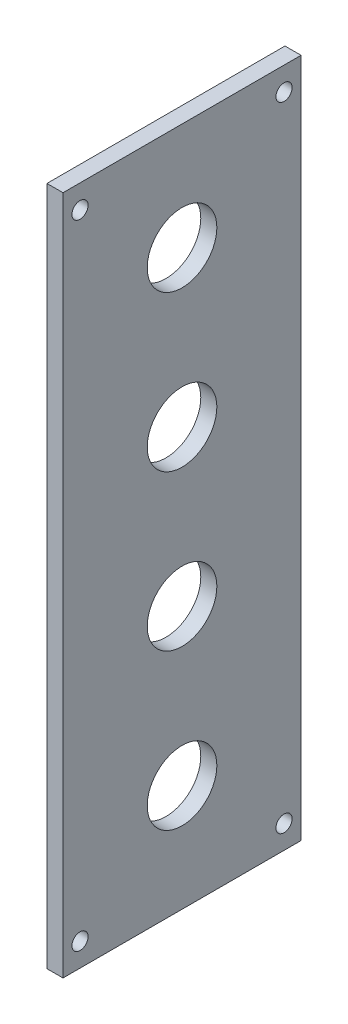
ISO-10303-21;
HEADER;
FILE_DESCRIPTION(('STEP AP214'),'2;1');
FILE_NAME('part.step','',(''),(''),'','','');
FILE_SCHEMA(('AUTOMOTIVE_DESIGN { 1 0 10303 214 1 1 1 1 }'));
ENDSEC;
DATA;
#1=APPLICATION_CONTEXT('core data for automotive mechanical design processes');
#2=APPLICATION_PROTOCOL_DEFINITION('international standard','automotive_design',2000,#1);
#3=PRODUCT_CONTEXT('',#1,'mechanical');
#4=PRODUCT('Part','Part','',(#3));
#5=PRODUCT_RELATED_PRODUCT_CATEGORY('part','',(#4));
#6=PRODUCT_DEFINITION_FORMATION('','',#4);
#7=PRODUCT_DEFINITION_CONTEXT('part definition',#1,'design');
#8=PRODUCT_DEFINITION('design','',#6,#7);
#9=PRODUCT_DEFINITION_SHAPE('','',#8);
#10=(LENGTH_UNIT() NAMED_UNIT(*) SI_UNIT(.MILLI.,.METRE.));
#11=(NAMED_UNIT(*) PLANE_ANGLE_UNIT() SI_UNIT($,.RADIAN.));
#12=(NAMED_UNIT(*) SI_UNIT($,.STERADIAN.) SOLID_ANGLE_UNIT());
#13=UNCERTAINTY_MEASURE_WITH_UNIT(LENGTH_MEASURE(1.E-05),#10,'distance_accuracy_value','');
#14=(GEOMETRIC_REPRESENTATION_CONTEXT(3) GLOBAL_UNCERTAINTY_ASSIGNED_CONTEXT((#13)) GLOBAL_UNIT_ASSIGNED_CONTEXT((#10,
#11,#12)) REPRESENTATION_CONTEXT('',''));
#15=CARTESIAN_POINT('',(0.,0.,0.));
#16=DIRECTION('',(0.,0.,1.));
#17=DIRECTION('',(1.,0.,0.));
#18=AXIS2_PLACEMENT_3D('',#15,#16,#17);
#19=CARTESIAN_POINT('',(-6.,0.,0.));
#20=DIRECTION('',(-1.,0.,0.));
#21=DIRECTION('',(0.,0.,1.));
#22=AXIS2_PLACEMENT_3D('',#19,#20,#21);
#23=PLANE('',#22);
#24=CARTESIAN_POINT('',(-6.,87.0000000000001,6.18172180111288E-13));
#25=DIRECTION('',(1.,0.,0.));
#26=DIRECTION('',(0.,0.,-1.));
#27=AXIS2_PLACEMENT_3D('',#24,#25,#26);
#28=CIRCLE('',#27,13.);
#29=CARTESIAN_POINT('',(-6.,87.0000000000001,-12.9999999999994));
#30=VERTEX_POINT('',#29);
#31=EDGE_CURVE('E171',#30,#30,#28,.T.);
#32=ORIENTED_EDGE('',*,*,#31,.T.);
#33=EDGE_LOOP('',(#32));
#34=FACE_BOUND('',#33,.T.);
#35=CARTESIAN_POINT('',(-6.,29.0000000000001,2.19488616045847E-13));
#36=DIRECTION('',(1.,0.,0.));
#37=DIRECTION('',(0.,0.,-1.));
#38=AXIS2_PLACEMENT_3D('',#35,#36,#37);
#39=CIRCLE('',#38,13.);
#40=CARTESIAN_POINT('',(-6.,29.0000000000001,-12.9999999999998));
#41=VERTEX_POINT('',#40);
#42=EDGE_CURVE('E181',#41,#41,#39,.T.);
#43=ORIENTED_EDGE('',*,*,#42,.T.);
#44=EDGE_LOOP('',(#43));
#45=FACE_BOUND('',#44,.T.);
#46=CARTESIAN_POINT('',(-6.,-28.9999999999999,-1.85523219259957E-13));
#47=DIRECTION('',(1.,0.,0.));
#48=DIRECTION('',(0.,0.,-1.));
#49=AXIS2_PLACEMENT_3D('',#46,#47,#48);
#50=CIRCLE('',#49,13.);
#51=CARTESIAN_POINT('',(-6.,-28.9999999999999,-13.0000000000002));
#52=VERTEX_POINT('',#51);
#53=EDGE_CURVE('E190',#52,#52,#50,.T.);
#54=ORIENTED_EDGE('',*,*,#53,.T.);
#55=EDGE_LOOP('',(#54));
#56=FACE_BOUND('',#55,.T.);
#57=DIRECTION('',(0.,0.,1.));
#58=VECTOR('',#57,1.);
#59=CARTESIAN_POINT('',(-6.,127.,-44.45));
#60=LINE('',#59,#58);
#61=CARTESIAN_POINT('',(-6.,127.,-44.45));
#62=VERTEX_POINT('',#61);
#63=CARTESIAN_POINT('',(-6.,127.,44.45));
#64=VERTEX_POINT('',#63);
#65=EDGE_CURVE('E96',#62,#64,#60,.T.);
#66=ORIENTED_EDGE('',*,*,#65,.F.);
#67=DIRECTION('',(0.,1.,0.));
#68=VECTOR('',#67,1.);
#69=CARTESIAN_POINT('',(-6.,-127.,-44.45));
#70=LINE('',#69,#68);
#71=CARTESIAN_POINT('',(-6.,-127.,-44.45));
#72=VERTEX_POINT('',#71);
#73=EDGE_CURVE('E94',#72,#62,#70,.T.);
#74=ORIENTED_EDGE('',*,*,#73,.F.);
#75=DIRECTION('',(0.,0.,-1.));
#76=VECTOR('',#75,1.);
#77=CARTESIAN_POINT('',(-6.,-127.,-44.45));
#78=LINE('',#77,#76);
#79=CARTESIAN_POINT('',(-6.,-127.,44.45));
#80=VERTEX_POINT('',#79);
#81=EDGE_CURVE('E87',#80,#72,#78,.T.);
#82=ORIENTED_EDGE('',*,*,#81,.F.);
#83=DIRECTION('',(0.,-1.,0.));
#84=VECTOR('',#83,1.);
#85=CARTESIAN_POINT('',(-6.,-127.,44.45));
#86=LINE('',#85,#84);
#87=EDGE_CURVE('E92',#64,#80,#86,.T.);
#88=ORIENTED_EDGE('',*,*,#87,.F.);
#89=EDGE_LOOP('',(#66,#74,#82,#88));
#90=FACE_BOUND('',#89,.T.);
#91=CARTESIAN_POINT('',(-6.,118.2625,38.1));
#92=DIRECTION('',(-1.,0.,0.));
#93=DIRECTION('',(0.,0.,1.));
#94=AXIS2_PLACEMENT_3D('',#91,#92,#93);
#95=CIRCLE('',#94,3.0226);
#96=CARTESIAN_POINT('',(-6.,118.2625,41.1226));
#97=VERTEX_POINT('',#96);
#98=EDGE_CURVE('E107',#97,#97,#95,.T.);
#99=ORIENTED_EDGE('',*,*,#98,.F.);
#100=EDGE_LOOP('',(#99));
#101=FACE_BOUND('',#100,.T.);
#102=CARTESIAN_POINT('',(-6.,118.2625,-38.1));
#103=DIRECTION('',(-1.,0.,0.));
#104=DIRECTION('',(0.,0.,1.));
#105=AXIS2_PLACEMENT_3D('',#102,#103,#104);
#106=CIRCLE('',#105,3.0226);
#107=CARTESIAN_POINT('',(-6.,118.2625,-35.0774));
#108=VERTEX_POINT('',#107);
#109=EDGE_CURVE('E212',#108,#108,#106,.T.);
#110=ORIENTED_EDGE('',*,*,#109,.F.);
#111=EDGE_LOOP('',(#110));
#112=FACE_BOUND('',#111,.T.);
#113=CARTESIAN_POINT('',(-6.,-118.2625,-38.1));
#114=DIRECTION('',(-1.,0.,0.));
#115=DIRECTION('',(0.,0.,1.));
#116=AXIS2_PLACEMENT_3D('',#113,#114,#115);
#117=CIRCLE('',#116,3.0226);
#118=CARTESIAN_POINT('',(-6.,-118.2625,-35.0774));
#119=VERTEX_POINT('',#118);
#120=EDGE_CURVE('E204',#119,#119,#117,.T.);
#121=ORIENTED_EDGE('',*,*,#120,.F.);
#122=EDGE_LOOP('',(#121));
#123=FACE_BOUND('',#122,.T.);
#124=CARTESIAN_POINT('',(-6.,-118.2625,38.1));
#125=DIRECTION('',(-1.,0.,0.));
#126=DIRECTION('',(0.,0.,1.));
#127=AXIS2_PLACEMENT_3D('',#124,#125,#126);
#128=CIRCLE('',#127,3.0226);
#129=CARTESIAN_POINT('',(-6.,-118.2625,41.1226));
#130=VERTEX_POINT('',#129);
#131=EDGE_CURVE('E200',#130,#130,#128,.T.);
#132=ORIENTED_EDGE('',*,*,#131,.F.);
#133=EDGE_LOOP('',(#132));
#134=FACE_BOUND('',#133,.T.);
#135=CARTESIAN_POINT('',(-6.,-86.9999999999999,-9.16595434226304E-13));
#136=DIRECTION('',(1.,0.,0.));
#137=DIRECTION('',(0.,0.,-1.));
#138=AXIS2_PLACEMENT_3D('',#135,#136,#137);
#139=CIRCLE('',#138,13.);
#140=CARTESIAN_POINT('',(-6.,-86.9999999999999,-13.0000000000009));
#141=VERTEX_POINT('',#140);
#142=EDGE_CURVE('E194',#141,#141,#139,.T.);
#143=ORIENTED_EDGE('',*,*,#142,.T.);
#144=EDGE_LOOP('',(#143));
#145=FACE_BOUND('',#144,.T.);
#146=ADVANCED_FACE('F39',(#34,#45,#56,#90,#101,#112,#123,#134,#145),#23,.T.);
#147=CARTESIAN_POINT('',(0.,0.,0.));
#148=DIRECTION('',(-1.,0.,0.));
#149=DIRECTION('',(0.,0.,1.));
#150=AXIS2_PLACEMENT_3D('',#147,#148,#149);
#151=PLANE('',#150);
#152=CARTESIAN_POINT('',(0.,87.0000000000001,6.18172180111288E-13));
#153=DIRECTION('',(1.,0.,0.));
#154=DIRECTION('',(0.,0.,-1.));
#155=AXIS2_PLACEMENT_3D('',#152,#153,#154);
#156=CIRCLE('',#155,13.);
#157=CARTESIAN_POINT('',(0.,87.0000000000001,-12.9999999999994));
#158=VERTEX_POINT('',#157);
#159=EDGE_CURVE('E172',#158,#158,#156,.T.);
#160=ORIENTED_EDGE('',*,*,#159,.F.);
#161=EDGE_LOOP('',(#160));
#162=FACE_BOUND('',#161,.T.);
#163=CARTESIAN_POINT('',(0.,29.0000000000001,2.19488616045847E-13));
#164=DIRECTION('',(1.,0.,0.));
#165=DIRECTION('',(0.,0.,-1.));
#166=AXIS2_PLACEMENT_3D('',#163,#164,#165);
#167=CIRCLE('',#166,13.);
#168=CARTESIAN_POINT('',(0.,29.0000000000001,-12.9999999999998));
#169=VERTEX_POINT('',#168);
#170=EDGE_CURVE('E176',#169,#169,#167,.T.);
#171=ORIENTED_EDGE('',*,*,#170,.F.);
#172=EDGE_LOOP('',(#171));
#173=FACE_BOUND('',#172,.T.);
#174=CARTESIAN_POINT('',(0.,-28.9999999999999,-1.85523219259957E-13));
#175=DIRECTION('',(1.,0.,0.));
#176=DIRECTION('',(0.,0.,-1.));
#177=AXIS2_PLACEMENT_3D('',#174,#175,#176);
#178=CIRCLE('',#177,13.);
#179=CARTESIAN_POINT('',(0.,-28.9999999999999,-13.0000000000002));
#180=VERTEX_POINT('',#179);
#181=EDGE_CURVE('E183',#180,#180,#178,.T.);
#182=ORIENTED_EDGE('',*,*,#181,.F.);
#183=EDGE_LOOP('',(#182));
#184=FACE_BOUND('',#183,.T.);
#185=CARTESIAN_POINT('',(0.,-86.9999999999999,-9.16595434226304E-13));
#186=DIRECTION('',(1.,0.,0.));
#187=DIRECTION('',(0.,0.,-1.));
#188=AXIS2_PLACEMENT_3D('',#185,#186,#187);
#189=CIRCLE('',#188,13.);
#190=CARTESIAN_POINT('',(0.,-86.9999999999999,-13.0000000000009));
#191=VERTEX_POINT('',#190);
#192=EDGE_CURVE('E188',#191,#191,#189,.T.);
#193=ORIENTED_EDGE('',*,*,#192,.F.);
#194=EDGE_LOOP('',(#193));
#195=FACE_BOUND('',#194,.T.);
#196=CARTESIAN_POINT('',(0.,-118.2625,-38.1));
#197=DIRECTION('',(1.,0.,0.));
#198=DIRECTION('',(0.,0.,-1.));
#199=AXIS2_PLACEMENT_3D('',#196,#197,#198);
#200=CIRCLE('',#199,3.0226);
#201=CARTESIAN_POINT('',(0.,-118.2625,-41.1226));
#202=VERTEX_POINT('',#201);
#203=EDGE_CURVE('E205',#202,#202,#200,.T.);
#204=ORIENTED_EDGE('',*,*,#203,.F.);
#205=EDGE_LOOP('',(#204));
#206=FACE_BOUND('',#205,.T.);
#207=DIRECTION('',(0.,0.,1.));
#208=VECTOR('',#207,1.);
#209=CARTESIAN_POINT('',(0.,127.,-44.45));
#210=LINE('',#209,#208);
#211=CARTESIAN_POINT('',(0.,127.,-44.45));
#212=VERTEX_POINT('',#211);
#213=CARTESIAN_POINT('',(0.,127.,44.45));
#214=VERTEX_POINT('',#213);
#215=EDGE_CURVE('E102',#212,#214,#210,.T.);
#216=ORIENTED_EDGE('',*,*,#215,.T.);
#217=DIRECTION('',(0.,-1.,0.));
#218=VECTOR('',#217,1.);
#219=CARTESIAN_POINT('',(0.,-127.,44.45));
#220=LINE('',#219,#218);
#221=CARTESIAN_POINT('',(0.,-127.,44.45));
#222=VERTEX_POINT('',#221);
#223=EDGE_CURVE('E108',#214,#222,#220,.T.);
#224=ORIENTED_EDGE('',*,*,#223,.T.);
#225=DIRECTION('',(0.,0.,-1.));
#226=VECTOR('',#225,1.);
#227=CARTESIAN_POINT('',(0.,-127.,-44.45));
#228=LINE('',#227,#226);
#229=CARTESIAN_POINT('',(0.,-127.,-44.45));
#230=VERTEX_POINT('',#229);
#231=EDGE_CURVE('E86',#222,#230,#228,.T.);
#232=ORIENTED_EDGE('',*,*,#231,.T.);
#233=DIRECTION('',(0.,1.,0.));
#234=VECTOR('',#233,1.);
#235=CARTESIAN_POINT('',(0.,-127.,-44.45));
#236=LINE('',#235,#234);
#237=EDGE_CURVE('E99',#230,#212,#236,.T.);
#238=ORIENTED_EDGE('',*,*,#237,.T.);
#239=EDGE_LOOP('',(#216,#224,#232,#238));
#240=FACE_BOUND('',#239,.T.);
#241=CARTESIAN_POINT('',(0.,118.2625,38.1));
#242=DIRECTION('',(1.,0.,0.));
#243=DIRECTION('',(0.,0.,-1.));
#244=AXIS2_PLACEMENT_3D('',#241,#242,#243);
#245=CIRCLE('',#244,3.0226);
#246=CARTESIAN_POINT('',(0.,118.2625,35.0774));
#247=VERTEX_POINT('',#246);
#248=EDGE_CURVE('E211',#247,#247,#245,.T.);
#249=ORIENTED_EDGE('',*,*,#248,.F.);
#250=EDGE_LOOP('',(#249));
#251=FACE_BOUND('',#250,.T.);
#252=CARTESIAN_POINT('',(0.,118.2625,-38.1));
#253=DIRECTION('',(1.,0.,0.));
#254=DIRECTION('',(0.,0.,-1.));
#255=AXIS2_PLACEMENT_3D('',#252,#253,#254);
#256=CIRCLE('',#255,3.0226);
#257=CARTESIAN_POINT('',(0.,118.2625,-41.1226));
#258=VERTEX_POINT('',#257);
#259=EDGE_CURVE('E206',#258,#258,#256,.T.);
#260=ORIENTED_EDGE('',*,*,#259,.F.);
#261=EDGE_LOOP('',(#260));
#262=FACE_BOUND('',#261,.T.);
#263=CARTESIAN_POINT('',(0.,-118.2625,38.1));
#264=DIRECTION('',(1.,0.,0.));
#265=DIRECTION('',(0.,0.,-1.));
#266=AXIS2_PLACEMENT_3D('',#263,#264,#265);
#267=CIRCLE('',#266,3.0226);
#268=CARTESIAN_POINT('',(0.,-118.2625,35.0774));
#269=VERTEX_POINT('',#268);
#270=EDGE_CURVE('E198',#269,#269,#267,.T.);
#271=ORIENTED_EDGE('',*,*,#270,.F.);
#272=EDGE_LOOP('',(#271));
#273=FACE_BOUND('',#272,.T.);
#274=ADVANCED_FACE('F114',(#162,#173,#184,#195,#206,#240,#251,#262,#273),#151,.F.);
#275=CARTESIAN_POINT('',(-6.,127.,-44.45));
#276=DIRECTION('',(0.,1.,0.));
#277=DIRECTION('',(0.,0.,1.));
#278=AXIS2_PLACEMENT_3D('',#275,#276,#277);
#279=PLANE('',#278);
#280=ORIENTED_EDGE('',*,*,#215,.F.);
#281=DIRECTION('',(1.,0.,0.));
#282=VECTOR('',#281,1.);
#283=CARTESIAN_POINT('',(-6.,127.,-44.45));
#284=LINE('',#283,#282);
#285=EDGE_CURVE('E11',#62,#212,#284,.T.);
#286=ORIENTED_EDGE('',*,*,#285,.F.);
#287=ORIENTED_EDGE('',*,*,#65,.T.);
#288=DIRECTION('',(1.,0.,0.));
#289=VECTOR('',#288,1.);
#290=CARTESIAN_POINT('',(-6.,127.,44.45));
#291=LINE('',#290,#289);
#292=EDGE_CURVE('E43',#64,#214,#291,.T.);
#293=ORIENTED_EDGE('',*,*,#292,.T.);
#294=EDGE_LOOP('',(#280,#286,#287,#293));
#295=FACE_BOUND('',#294,.T.);
#296=ADVANCED_FACE('F41',(#295),#279,.T.);
#297=CARTESIAN_POINT('',(-6.,-127.,-44.45));
#298=DIRECTION('',(0.,0.,-1.));
#299=DIRECTION('',(-1.,0.,0.));
#300=AXIS2_PLACEMENT_3D('',#297,#298,#299);
#301=PLANE('',#300);
#302=ORIENTED_EDGE('',*,*,#237,.F.);
#303=DIRECTION('',(1.,0.,0.));
#304=VECTOR('',#303,1.);
#305=CARTESIAN_POINT('',(-6.,-127.,-44.45));
#306=LINE('',#305,#304);
#307=EDGE_CURVE('E47',#72,#230,#306,.T.);
#308=ORIENTED_EDGE('',*,*,#307,.F.);
#309=ORIENTED_EDGE('',*,*,#73,.T.);
#310=ORIENTED_EDGE('',*,*,#285,.T.);
#311=EDGE_LOOP('',(#302,#308,#309,#310));
#312=FACE_BOUND('',#311,.T.);
#313=ADVANCED_FACE('F120',(#312),#301,.T.);
#314=CARTESIAN_POINT('',(-6.,-127.,-44.45));
#315=DIRECTION('',(0.,-1.,0.));
#316=DIRECTION('',(0.,0.,-1.));
#317=AXIS2_PLACEMENT_3D('',#314,#315,#316);
#318=PLANE('',#317);
#319=ORIENTED_EDGE('',*,*,#231,.F.);
#320=DIRECTION('',(1.,0.,0.));
#321=VECTOR('',#320,1.);
#322=CARTESIAN_POINT('',(-6.,-127.,44.45));
#323=LINE('',#322,#321);
#324=EDGE_CURVE('E83',#80,#222,#323,.T.);
#325=ORIENTED_EDGE('',*,*,#324,.F.);
#326=ORIENTED_EDGE('',*,*,#81,.T.);
#327=ORIENTED_EDGE('',*,*,#307,.T.);
#328=EDGE_LOOP('',(#319,#325,#326,#327));
#329=FACE_BOUND('',#328,.T.);
#330=ADVANCED_FACE('F89',(#329),#318,.T.);
#331=CARTESIAN_POINT('',(-6.,-127.,44.45));
#332=DIRECTION('',(0.,0.,1.));
#333=DIRECTION('',(1.,0.,0.));
#334=AXIS2_PLACEMENT_3D('',#331,#332,#333);
#335=PLANE('',#334);
#336=ORIENTED_EDGE('',*,*,#223,.F.);
#337=ORIENTED_EDGE('',*,*,#292,.F.);
#338=ORIENTED_EDGE('',*,*,#87,.T.);
#339=ORIENTED_EDGE('',*,*,#324,.T.);
#340=EDGE_LOOP('',(#336,#337,#338,#339));
#341=FACE_BOUND('',#340,.T.);
#342=ADVANCED_FACE('F97',(#341),#335,.T.);
#343=CARTESIAN_POINT('',(0.,118.2625,38.1));
#344=DIRECTION('',(1.,0.,0.));
#345=DIRECTION('',(0.,0.,-1.));
#346=AXIS2_PLACEMENT_3D('',#343,#344,#345);
#347=CYLINDRICAL_SURFACE('',#346,3.0226);
#348=ORIENTED_EDGE('',*,*,#248,.T.);
#349=EDGE_LOOP('',(#348));
#350=FACE_BOUND('',#349,.T.);
#351=ORIENTED_EDGE('',*,*,#98,.T.);
#352=EDGE_LOOP('',(#351));
#353=FACE_BOUND('',#352,.T.);
#354=ADVANCED_FACE('F140',(#350,#353),#347,.F.);
#355=CARTESIAN_POINT('',(0.,118.2625,-38.1));
#356=DIRECTION('',(1.,0.,0.));
#357=DIRECTION('',(0.,0.,-1.));
#358=AXIS2_PLACEMENT_3D('',#355,#356,#357);
#359=CYLINDRICAL_SURFACE('',#358,3.0226);
#360=ORIENTED_EDGE('',*,*,#259,.T.);
#361=EDGE_LOOP('',(#360));
#362=FACE_BOUND('',#361,.T.);
#363=ORIENTED_EDGE('',*,*,#109,.T.);
#364=EDGE_LOOP('',(#363));
#365=FACE_BOUND('',#364,.T.);
#366=ADVANCED_FACE('F139',(#362,#365),#359,.F.);
#367=CARTESIAN_POINT('',(0.,-118.2625,-38.1));
#368=DIRECTION('',(1.,0.,0.));
#369=DIRECTION('',(0.,0.,-1.));
#370=AXIS2_PLACEMENT_3D('',#367,#368,#369);
#371=CYLINDRICAL_SURFACE('',#370,3.0226);
#372=ORIENTED_EDGE('',*,*,#203,.T.);
#373=EDGE_LOOP('',(#372));
#374=FACE_BOUND('',#373,.T.);
#375=ORIENTED_EDGE('',*,*,#120,.T.);
#376=EDGE_LOOP('',(#375));
#377=FACE_BOUND('',#376,.T.);
#378=ADVANCED_FACE('F144',(#374,#377),#371,.F.);
#379=CARTESIAN_POINT('',(0.,-118.2625,38.1));
#380=DIRECTION('',(1.,0.,0.));
#381=DIRECTION('',(0.,0.,-1.));
#382=AXIS2_PLACEMENT_3D('',#379,#380,#381);
#383=CYLINDRICAL_SURFACE('',#382,3.0226);
#384=ORIENTED_EDGE('',*,*,#270,.T.);
#385=EDGE_LOOP('',(#384));
#386=FACE_BOUND('',#385,.T.);
#387=ORIENTED_EDGE('',*,*,#131,.T.);
#388=EDGE_LOOP('',(#387));
#389=FACE_BOUND('',#388,.T.);
#390=ADVANCED_FACE('F149',(#386,#389),#383,.F.);
#391=CARTESIAN_POINT('',(0.,-86.9999999999999,-9.16595434226304E-13));
#392=DIRECTION('',(1.,0.,0.));
#393=DIRECTION('',(0.,0.,-1.));
#394=AXIS2_PLACEMENT_3D('',#391,#392,#393);
#395=CYLINDRICAL_SURFACE('',#394,13.);
#396=ORIENTED_EDGE('',*,*,#142,.F.);
#397=EDGE_LOOP('',(#396));
#398=FACE_BOUND('',#397,.T.);
#399=ORIENTED_EDGE('',*,*,#192,.T.);
#400=EDGE_LOOP('',(#399));
#401=FACE_BOUND('',#400,.T.);
#402=ADVANCED_FACE('F153',(#398,#401),#395,.F.);
#403=CARTESIAN_POINT('',(0.,-28.9999999999999,-1.85523219259957E-13));
#404=DIRECTION('',(1.,0.,0.));
#405=DIRECTION('',(0.,0.,-1.));
#406=AXIS2_PLACEMENT_3D('',#403,#404,#405);
#407=CYLINDRICAL_SURFACE('',#406,13.);
#408=ORIENTED_EDGE('',*,*,#53,.F.);
#409=EDGE_LOOP('',(#408));
#410=FACE_BOUND('',#409,.T.);
#411=ORIENTED_EDGE('',*,*,#181,.T.);
#412=EDGE_LOOP('',(#411));
#413=FACE_BOUND('',#412,.T.);
#414=ADVANCED_FACE('F151',(#410,#413),#407,.F.);
#415=CARTESIAN_POINT('',(0.,29.0000000000001,2.19488616045847E-13));
#416=DIRECTION('',(1.,0.,0.));
#417=DIRECTION('',(0.,0.,-1.));
#418=AXIS2_PLACEMENT_3D('',#415,#416,#417);
#419=CYLINDRICAL_SURFACE('',#418,13.);
#420=ORIENTED_EDGE('',*,*,#42,.F.);
#421=EDGE_LOOP('',(#420));
#422=FACE_BOUND('',#421,.T.);
#423=ORIENTED_EDGE('',*,*,#170,.T.);
#424=EDGE_LOOP('',(#423));
#425=FACE_BOUND('',#424,.T.);
#426=ADVANCED_FACE('F157',(#422,#425),#419,.F.);
#427=CARTESIAN_POINT('',(0.,87.0000000000001,6.18172180111288E-13));
#428=DIRECTION('',(1.,0.,0.));
#429=DIRECTION('',(0.,0.,-1.));
#430=AXIS2_PLACEMENT_3D('',#427,#428,#429);
#431=CYLINDRICAL_SURFACE('',#430,13.);
#432=ORIENTED_EDGE('',*,*,#31,.F.);
#433=EDGE_LOOP('',(#432));
#434=FACE_BOUND('',#433,.T.);
#435=ORIENTED_EDGE('',*,*,#159,.T.);
#436=EDGE_LOOP('',(#435));
#437=FACE_BOUND('',#436,.T.);
#438=ADVANCED_FACE('F161',(#434,#437),#431,.F.);
#439=CLOSED_SHELL('',(#146,#274,#296,#313,#330,#342,#354,#366,#378,#390,#402,#414,#426,#438));
#440=MANIFOLD_SOLID_BREP('B2',#439);
#441=ADVANCED_BREP_SHAPE_REPRESENTATION('',(#18,#440),#14);
#442=SHAPE_DEFINITION_REPRESENTATION(#9,#441);
ENDSEC;
END-ISO-10303-21;
